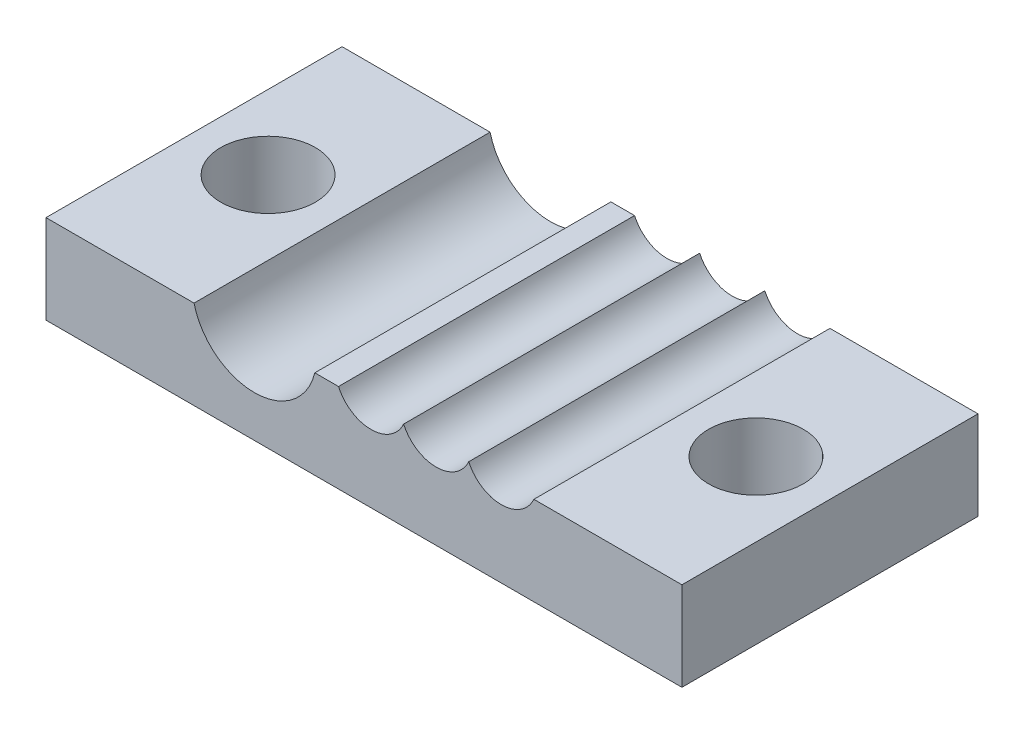
ISO-10303-21;
HEADER;
FILE_DESCRIPTION(('STEP AP214'),'2;1');
FILE_NAME('part.step','',(''),(''),'','','');
FILE_SCHEMA(('AUTOMOTIVE_DESIGN { 1 0 10303 214 1 1 1 1 }'));
ENDSEC;
DATA;
#1=APPLICATION_CONTEXT('core data for automotive mechanical design processes');
#2=APPLICATION_PROTOCOL_DEFINITION('international standard','automotive_design',2000,#1);
#3=PRODUCT_CONTEXT('',#1,'mechanical');
#4=PRODUCT('Part','Part','',(#3));
#5=PRODUCT_RELATED_PRODUCT_CATEGORY('part','',(#4));
#6=PRODUCT_DEFINITION_FORMATION('','',#4);
#7=PRODUCT_DEFINITION_CONTEXT('part definition',#1,'design');
#8=PRODUCT_DEFINITION('design','',#6,#7);
#9=PRODUCT_DEFINITION_SHAPE('','',#8);
#10=(LENGTH_UNIT() NAMED_UNIT(*) SI_UNIT(.MILLI.,.METRE.));
#11=(NAMED_UNIT(*) PLANE_ANGLE_UNIT() SI_UNIT($,.RADIAN.));
#12=(NAMED_UNIT(*) SI_UNIT($,.STERADIAN.) SOLID_ANGLE_UNIT());
#13=UNCERTAINTY_MEASURE_WITH_UNIT(LENGTH_MEASURE(1.E-05),#10,'distance_accuracy_value','');
#14=(GEOMETRIC_REPRESENTATION_CONTEXT(3) GLOBAL_UNCERTAINTY_ASSIGNED_CONTEXT((#13)) GLOBAL_UNIT_ASSIGNED_CONTEXT((#10,
#11,#12)) REPRESENTATION_CONTEXT('',''));
#15=CARTESIAN_POINT('',(0.,0.,0.));
#16=DIRECTION('',(0.,0.,1.));
#17=DIRECTION('',(1.,0.,0.));
#18=AXIS2_PLACEMENT_3D('',#15,#16,#17);
#19=CARTESIAN_POINT('',(0.,0.,10.));
#20=DIRECTION('',(1.,0.,0.));
#21=DIRECTION('',(0.,0.,-1.));
#22=AXIS2_PLACEMENT_3D('',#19,#20,#21);
#23=PLANE('',#22);
#24=DIRECTION('',(0.,-1.,0.));
#25=VECTOR('',#24,1.);
#26=CARTESIAN_POINT('',(0.,0.,0.));
#27=LINE('',#26,#25);
#28=CARTESIAN_POINT('',(0.,3.,0.));
#29=VERTEX_POINT('',#28);
#30=CARTESIAN_POINT('',(0.,0.,0.));
#31=VERTEX_POINT('',#30);
#32=EDGE_CURVE('E145',#29,#31,#27,.T.);
#33=ORIENTED_EDGE('',*,*,#32,.T.);
#34=DIRECTION('',(0.,0.,-1.));
#35=VECTOR('',#34,1.);
#36=CARTESIAN_POINT('',(0.,0.,10.));
#37=LINE('',#36,#35);
#38=CARTESIAN_POINT('',(0.,0.,10.));
#39=VERTEX_POINT('',#38);
#40=EDGE_CURVE('E11',#39,#31,#37,.T.);
#41=ORIENTED_EDGE('',*,*,#40,.F.);
#42=DIRECTION('',(0.,-1.,0.));
#43=VECTOR('',#42,1.);
#44=CARTESIAN_POINT('',(0.,0.,10.));
#45=LINE('',#44,#43);
#46=CARTESIAN_POINT('',(0.,3.,10.));
#47=VERTEX_POINT('',#46);
#48=EDGE_CURVE('E164',#47,#39,#45,.T.);
#49=ORIENTED_EDGE('',*,*,#48,.F.);
#50=DIRECTION('',(0.,0.,-1.));
#51=VECTOR('',#50,1.);
#52=CARTESIAN_POINT('',(0.,3.,10.));
#53=LINE('',#52,#51);
#54=EDGE_CURVE('E141',#47,#29,#53,.T.);
#55=ORIENTED_EDGE('',*,*,#54,.T.);
#56=EDGE_LOOP('',(#33,#41,#49,#55));
#57=FACE_BOUND('',#56,.T.);
#58=ADVANCED_FACE('F37',(#57),#23,.F.);
#59=CARTESIAN_POINT('',(0.,0.,10.));
#60=DIRECTION('',(0.,1.,0.));
#61=DIRECTION('',(-1.,0.,0.));
#62=AXIS2_PLACEMENT_3D('',#59,#60,#61);
#63=PLANE('',#62);
#64=CARTESIAN_POINT('',(2.5,0.,5.));
#65=DIRECTION('',(0.,-1.,0.));
#66=DIRECTION('',(1.,0.,0.));
#67=AXIS2_PLACEMENT_3D('',#64,#65,#66);
#68=CIRCLE('',#67,1.6);
#69=CARTESIAN_POINT('',(4.1,0.,5.));
#70=VERTEX_POINT('',#69);
#71=EDGE_CURVE('E217',#70,#70,#68,.T.);
#72=ORIENTED_EDGE('',*,*,#71,.F.);
#73=EDGE_LOOP('',(#72));
#74=FACE_BOUND('',#73,.T.);
#75=CARTESIAN_POINT('',(18.9792156108742,0.,5.));
#76=DIRECTION('',(0.,-1.,0.));
#77=DIRECTION('',(1.,0.,0.));
#78=AXIS2_PLACEMENT_3D('',#75,#76,#77);
#79=CIRCLE('',#78,1.6);
#80=CARTESIAN_POINT('',(20.5792156108742,0.,5.));
#81=VERTEX_POINT('',#80);
#82=EDGE_CURVE('E214',#81,#81,#79,.T.);
#83=ORIENTED_EDGE('',*,*,#82,.F.);
#84=EDGE_LOOP('',(#83));
#85=FACE_BOUND('',#84,.T.);
#86=DIRECTION('',(1.,0.,0.));
#87=VECTOR('',#86,1.);
#88=CARTESIAN_POINT('',(0.,0.,0.));
#89=LINE('',#88,#87);
#90=CARTESIAN_POINT('',(21.4792156108742,0.,0.));
#91=VERTEX_POINT('',#90);
#92=EDGE_CURVE('E148',#31,#91,#89,.T.);
#93=ORIENTED_EDGE('',*,*,#92,.T.);
#94=DIRECTION('',(0.,0.,-1.));
#95=VECTOR('',#94,1.);
#96=CARTESIAN_POINT('',(21.4792156108742,0.,10.));
#97=LINE('',#96,#95);
#98=CARTESIAN_POINT('',(21.4792156108742,0.,10.));
#99=VERTEX_POINT('',#98);
#100=EDGE_CURVE('E45',#99,#91,#97,.T.);
#101=ORIENTED_EDGE('',*,*,#100,.F.);
#102=DIRECTION('',(1.,0.,0.));
#103=VECTOR('',#102,1.);
#104=CARTESIAN_POINT('',(0.,0.,10.));
#105=LINE('',#104,#103);
#106=EDGE_CURVE('E102',#39,#99,#105,.T.);
#107=ORIENTED_EDGE('',*,*,#106,.F.);
#108=ORIENTED_EDGE('',*,*,#40,.T.);
#109=EDGE_LOOP('',(#93,#101,#107,#108));
#110=FACE_BOUND('',#109,.T.);
#111=ADVANCED_FACE('F232',(#74,#85,#110),#63,.F.);
#112=CARTESIAN_POINT('',(21.4792156108742,0.,10.));
#113=DIRECTION('',(-1.,0.,0.));
#114=DIRECTION('',(0.,0.,1.));
#115=AXIS2_PLACEMENT_3D('',#112,#113,#114);
#116=PLANE('',#115);
#117=DIRECTION('',(0.,1.,0.));
#118=VECTOR('',#117,1.);
#119=CARTESIAN_POINT('',(21.4792156108742,0.,0.));
#120=LINE('',#119,#118);
#121=CARTESIAN_POINT('',(21.4792156108742,3.,0.));
#122=VERTEX_POINT('',#121);
#123=EDGE_CURVE('E151',#91,#122,#120,.T.);
#124=ORIENTED_EDGE('',*,*,#123,.T.);
#125=DIRECTION('',(0.,0.,-1.));
#126=VECTOR('',#125,1.);
#127=CARTESIAN_POINT('',(21.4792156108742,3.,10.));
#128=LINE('',#127,#126);
#129=CARTESIAN_POINT('',(21.4792156108742,3.,10.));
#130=VERTEX_POINT('',#129);
#131=EDGE_CURVE('E177',#130,#122,#128,.T.);
#132=ORIENTED_EDGE('',*,*,#131,.F.);
#133=DIRECTION('',(0.,1.,0.));
#134=VECTOR('',#133,1.);
#135=CARTESIAN_POINT('',(21.4792156108742,0.,10.));
#136=LINE('',#135,#134);
#137=EDGE_CURVE('E185',#99,#130,#136,.T.);
#138=ORIENTED_EDGE('',*,*,#137,.F.);
#139=ORIENTED_EDGE('',*,*,#100,.T.);
#140=EDGE_LOOP('',(#124,#132,#138,#139));
#141=FACE_BOUND('',#140,.T.);
#142=ADVANCED_FACE('F183',(#141),#116,.F.);
#143=CARTESIAN_POINT('',(16.4792156108742,3.,10.));
#144=DIRECTION('',(0.,-1.,0.));
#145=DIRECTION('',(0.,0.,-1.));
#146=AXIS2_PLACEMENT_3D('',#143,#144,#145);
#147=PLANE('',#146);
#148=CARTESIAN_POINT('',(18.9792156108742,3.,5.));
#149=DIRECTION('',(0.,-1.,0.));
#150=DIRECTION('',(1.,0.,0.));
#151=AXIS2_PLACEMENT_3D('',#148,#149,#150);
#152=CIRCLE('',#151,1.6);
#153=CARTESIAN_POINT('',(20.5792156108742,3.,5.));
#154=VERTEX_POINT('',#153);
#155=EDGE_CURVE('E211',#154,#154,#152,.T.);
#156=ORIENTED_EDGE('',*,*,#155,.T.);
#157=EDGE_LOOP('',(#156));
#158=FACE_BOUND('',#157,.T.);
#159=DIRECTION('',(-1.,0.,0.));
#160=VECTOR('',#159,1.);
#161=CARTESIAN_POINT('',(16.4792156108742,3.,0.));
#162=LINE('',#161,#160);
#163=CARTESIAN_POINT('',(16.4792156108742,3.,0.));
#164=VERTEX_POINT('',#163);
#165=EDGE_CURVE('E153',#122,#164,#162,.T.);
#166=ORIENTED_EDGE('',*,*,#165,.T.);
#167=DIRECTION('',(0.,0.,-1.));
#168=VECTOR('',#167,1.);
#169=CARTESIAN_POINT('',(16.4792156108742,3.,10.));
#170=LINE('',#169,#168);
#171=CARTESIAN_POINT('',(16.4792156108742,3.,10.));
#172=VERTEX_POINT('',#171);
#173=EDGE_CURVE('E174',#172,#164,#170,.T.);
#174=ORIENTED_EDGE('',*,*,#173,.F.);
#175=DIRECTION('',(-1.,0.,0.));
#176=VECTOR('',#175,1.);
#177=CARTESIAN_POINT('',(16.4792156108742,3.,10.));
#178=LINE('',#177,#176);
#179=EDGE_CURVE('E203',#130,#172,#178,.T.);
#180=ORIENTED_EDGE('',*,*,#179,.F.);
#181=ORIENTED_EDGE('',*,*,#131,.T.);
#182=EDGE_LOOP('',(#166,#174,#180,#181));
#183=FACE_BOUND('',#182,.T.);
#184=ADVANCED_FACE('F194',(#158,#183),#147,.F.);
#185=CARTESIAN_POINT('',(15.3792156108742,3.5,10.));
#186=DIRECTION('',(0.,0.,-1.));
#187=DIRECTION('',(-1.,0.,0.));
#188=AXIS2_PLACEMENT_3D('',#185,#186,#187);
#189=CYLINDRICAL_SURFACE('',#188,1.20830459735946);
#190=CARTESIAN_POINT('',(15.3792156108742,3.5,0.));
#191=DIRECTION('',(0.,0.,-1.));
#192=DIRECTION('',(1.,0.,0.));
#193=AXIS2_PLACEMENT_3D('',#190,#191,#192);
#194=CIRCLE('',#193,1.20830459735946);
#195=CARTESIAN_POINT('',(14.2792156108742,3.,0.));
#196=VERTEX_POINT('',#195);
#197=EDGE_CURVE('E155',#164,#196,#194,.T.);
#198=ORIENTED_EDGE('',*,*,#197,.T.);
#199=DIRECTION('',(0.,0.,-1.));
#200=VECTOR('',#199,1.);
#201=CARTESIAN_POINT('',(14.2792156108742,3.,10.));
#202=LINE('',#201,#200);
#203=CARTESIAN_POINT('',(14.2792156108742,3.,10.));
#204=VERTEX_POINT('',#203);
#205=EDGE_CURVE('E171',#204,#196,#202,.T.);
#206=ORIENTED_EDGE('',*,*,#205,.F.);
#207=CARTESIAN_POINT('',(15.3792156108742,3.5,10.));
#208=DIRECTION('',(0.,0.,-1.));
#209=DIRECTION('',(1.,0.,0.));
#210=AXIS2_PLACEMENT_3D('',#207,#208,#209);
#211=CIRCLE('',#210,1.20830459735946);
#212=EDGE_CURVE('E200',#172,#204,#211,.T.);
#213=ORIENTED_EDGE('',*,*,#212,.F.);
#214=ORIENTED_EDGE('',*,*,#173,.T.);
#215=EDGE_LOOP('',(#198,#206,#213,#214));
#216=FACE_BOUND('',#215,.T.);
#217=ADVANCED_FACE('F198',(#216),#189,.F.);
#218=CARTESIAN_POINT('',(13.1792156108742,3.5,10.));
#219=DIRECTION('',(0.,0.,-1.));
#220=DIRECTION('',(-1.,0.,0.));
#221=AXIS2_PLACEMENT_3D('',#218,#219,#220);
#222=CYLINDRICAL_SURFACE('',#221,1.20830459735946);
#223=CARTESIAN_POINT('',(13.1792156108742,3.5,0.));
#224=DIRECTION('',(0.,0.,-1.));
#225=DIRECTION('',(1.,0.,0.));
#226=AXIS2_PLACEMENT_3D('',#223,#224,#225);
#227=CIRCLE('',#226,1.20830459735946);
#228=CARTESIAN_POINT('',(12.0792156108742,3.,0.));
#229=VERTEX_POINT('',#228);
#230=EDGE_CURVE('E157',#196,#229,#227,.T.);
#231=ORIENTED_EDGE('',*,*,#230,.T.);
#232=DIRECTION('',(0.,0.,-1.));
#233=VECTOR('',#232,1.);
#234=CARTESIAN_POINT('',(12.0792156108742,3.,10.));
#235=LINE('',#234,#233);
#236=CARTESIAN_POINT('',(12.0792156108742,3.,10.));
#237=VERTEX_POINT('',#236);
#238=EDGE_CURVE('E168',#237,#229,#235,.T.);
#239=ORIENTED_EDGE('',*,*,#238,.F.);
#240=CARTESIAN_POINT('',(13.1792156108742,3.5,10.));
#241=DIRECTION('',(0.,0.,-1.));
#242=DIRECTION('',(1.,0.,0.));
#243=AXIS2_PLACEMENT_3D('',#240,#241,#242);
#244=CIRCLE('',#243,1.20830459735946);
#245=EDGE_CURVE('E202',#204,#237,#244,.T.);
#246=ORIENTED_EDGE('',*,*,#245,.F.);
#247=ORIENTED_EDGE('',*,*,#205,.T.);
#248=EDGE_LOOP('',(#231,#239,#246,#247));
#249=FACE_BOUND('',#248,.T.);
#250=ADVANCED_FACE('F244',(#249),#222,.F.);
#251=CARTESIAN_POINT('',(10.9792156108742,3.5,10.));
#252=DIRECTION('',(0.,0.,-1.));
#253=DIRECTION('',(-1.,0.,0.));
#254=AXIS2_PLACEMENT_3D('',#251,#252,#253);
#255=CYLINDRICAL_SURFACE('',#254,1.20830459735946);
#256=CARTESIAN_POINT('',(10.9792156108742,3.5,0.));
#257=DIRECTION('',(0.,0.,-1.));
#258=DIRECTION('',(1.,0.,0.));
#259=AXIS2_PLACEMENT_3D('',#256,#257,#258);
#260=CIRCLE('',#259,1.20830459735946);
#261=CARTESIAN_POINT('',(9.87921561087423,3.,0.));
#262=VERTEX_POINT('',#261);
#263=EDGE_CURVE('E159',#229,#262,#260,.T.);
#264=ORIENTED_EDGE('',*,*,#263,.T.);
#265=DIRECTION('',(0.,0.,-1.));
#266=VECTOR('',#265,1.);
#267=CARTESIAN_POINT('',(9.87921561087423,3.,10.));
#268=LINE('',#267,#266);
#269=CARTESIAN_POINT('',(9.87921561087423,3.,10.));
#270=VERTEX_POINT('',#269);
#271=EDGE_CURVE('E136',#270,#262,#268,.T.);
#272=ORIENTED_EDGE('',*,*,#271,.F.);
#273=CARTESIAN_POINT('',(10.9792156108742,3.5,10.));
#274=DIRECTION('',(0.,0.,-1.));
#275=DIRECTION('',(1.,0.,0.));
#276=AXIS2_PLACEMENT_3D('',#273,#274,#275);
#277=CIRCLE('',#276,1.20830459735946);
#278=EDGE_CURVE('E127',#237,#270,#277,.T.);
#279=ORIENTED_EDGE('',*,*,#278,.F.);
#280=ORIENTED_EDGE('',*,*,#238,.T.);
#281=EDGE_LOOP('',(#264,#272,#279,#280));
#282=FACE_BOUND('',#281,.T.);
#283=ADVANCED_FACE('F241',(#282),#255,.F.);
#284=CARTESIAN_POINT('',(9.07921561087423,3.,10.));
#285=DIRECTION('',(0.,-1.,0.));
#286=DIRECTION('',(0.,0.,-1.));
#287=AXIS2_PLACEMENT_3D('',#284,#285,#286);
#288=PLANE('',#287);
#289=DIRECTION('',(-1.,0.,0.));
#290=VECTOR('',#289,1.);
#291=CARTESIAN_POINT('',(9.07921561087423,3.,0.));
#292=LINE('',#291,#290);
#293=CARTESIAN_POINT('',(9.07921561087423,3.,0.));
#294=VERTEX_POINT('',#293);
#295=EDGE_CURVE('E135',#262,#294,#292,.T.);
#296=ORIENTED_EDGE('',*,*,#295,.T.);
#297=DIRECTION('',(0.,0.,-1.));
#298=VECTOR('',#297,1.);
#299=CARTESIAN_POINT('',(9.07921561087423,3.,10.));
#300=LINE('',#299,#298);
#301=CARTESIAN_POINT('',(9.07921561087423,3.,10.));
#302=VERTEX_POINT('',#301);
#303=EDGE_CURVE('E132',#302,#294,#300,.T.);
#304=ORIENTED_EDGE('',*,*,#303,.F.);
#305=DIRECTION('',(-1.,0.,0.));
#306=VECTOR('',#305,1.);
#307=CARTESIAN_POINT('',(9.07921561087423,3.,10.));
#308=LINE('',#307,#306);
#309=EDGE_CURVE('E121',#270,#302,#308,.T.);
#310=ORIENTED_EDGE('',*,*,#309,.F.);
#311=ORIENTED_EDGE('',*,*,#271,.T.);
#312=EDGE_LOOP('',(#296,#304,#310,#311));
#313=FACE_BOUND('',#312,.T.);
#314=ADVANCED_FACE('F133',(#313),#288,.F.);
#315=CARTESIAN_POINT('',(7.03960780543711,3.5,10.));
#316=DIRECTION('',(0.,0.,-1.));
#317=DIRECTION('',(-1.,0.,0.));
#318=AXIS2_PLACEMENT_3D('',#315,#316,#317);
#319=CYLINDRICAL_SURFACE('',#318,2.1);
#320=CARTESIAN_POINT('',(7.03960780543711,3.5,0.));
#321=DIRECTION('',(0.,0.,-1.));
#322=DIRECTION('',(1.,0.,0.));
#323=AXIS2_PLACEMENT_3D('',#320,#321,#322);
#324=CIRCLE('',#323,2.1);
#325=CARTESIAN_POINT('',(5.,3.,0.));
#326=VERTEX_POINT('',#325);
#327=EDGE_CURVE('E88',#294,#326,#324,.T.);
#328=ORIENTED_EDGE('',*,*,#327,.T.);
#329=DIRECTION('',(0.,0.,-1.));
#330=VECTOR('',#329,1.);
#331=CARTESIAN_POINT('',(5.,3.,10.));
#332=LINE('',#331,#330);
#333=CARTESIAN_POINT('',(5.,3.,10.));
#334=VERTEX_POINT('',#333);
#335=EDGE_CURVE('E137',#334,#326,#332,.T.);
#336=ORIENTED_EDGE('',*,*,#335,.F.);
#337=CARTESIAN_POINT('',(7.03960780543711,3.5,10.));
#338=DIRECTION('',(0.,0.,-1.));
#339=DIRECTION('',(1.,0.,0.));
#340=AXIS2_PLACEMENT_3D('',#337,#338,#339);
#341=CIRCLE('',#340,2.1);
#342=EDGE_CURVE('E125',#302,#334,#341,.T.);
#343=ORIENTED_EDGE('',*,*,#342,.F.);
#344=ORIENTED_EDGE('',*,*,#303,.T.);
#345=EDGE_LOOP('',(#328,#336,#343,#344));
#346=FACE_BOUND('',#345,.T.);
#347=ADVANCED_FACE('F139',(#346),#319,.F.);
#348=CARTESIAN_POINT('',(0.,3.,10.));
#349=DIRECTION('',(0.,-1.,0.));
#350=DIRECTION('',(0.,0.,-1.));
#351=AXIS2_PLACEMENT_3D('',#348,#349,#350);
#352=PLANE('',#351);
#353=CARTESIAN_POINT('',(2.5,3.,5.));
#354=DIRECTION('',(0.,-1.,0.));
#355=DIRECTION('',(1.,0.,0.));
#356=AXIS2_PLACEMENT_3D('',#353,#354,#355);
#357=CIRCLE('',#356,1.6);
#358=CARTESIAN_POINT('',(4.1,3.,5.));
#359=VERTEX_POINT('',#358);
#360=EDGE_CURVE('E149',#359,#359,#357,.T.);
#361=ORIENTED_EDGE('',*,*,#360,.T.);
#362=EDGE_LOOP('',(#361));
#363=FACE_BOUND('',#362,.T.);
#364=DIRECTION('',(-1.,0.,0.));
#365=VECTOR('',#364,1.);
#366=CARTESIAN_POINT('',(0.,3.,0.));
#367=LINE('',#366,#365);
#368=EDGE_CURVE('E94',#326,#29,#367,.T.);
#369=ORIENTED_EDGE('',*,*,#368,.T.);
#370=ORIENTED_EDGE('',*,*,#54,.F.);
#371=DIRECTION('',(-1.,0.,0.));
#372=VECTOR('',#371,1.);
#373=CARTESIAN_POINT('',(0.,3.,10.));
#374=LINE('',#373,#372);
#375=EDGE_CURVE('E53',#334,#47,#374,.T.);
#376=ORIENTED_EDGE('',*,*,#375,.F.);
#377=ORIENTED_EDGE('',*,*,#335,.T.);
#378=EDGE_LOOP('',(#369,#370,#376,#377));
#379=FACE_BOUND('',#378,.T.);
#380=ADVANCED_FACE('F223',(#363,#379),#352,.F.);
#381=CARTESIAN_POINT('',(7.03960780543711,3.5,10.));
#382=DIRECTION('',(0.,0.,1.));
#383=DIRECTION('',(1.,0.,0.));
#384=AXIS2_PLACEMENT_3D('',#381,#382,#383);
#385=PLANE('',#384);
#386=ORIENTED_EDGE('',*,*,#48,.T.);
#387=ORIENTED_EDGE('',*,*,#106,.T.);
#388=ORIENTED_EDGE('',*,*,#137,.T.);
#389=ORIENTED_EDGE('',*,*,#179,.T.);
#390=ORIENTED_EDGE('',*,*,#212,.T.);
#391=ORIENTED_EDGE('',*,*,#245,.T.);
#392=ORIENTED_EDGE('',*,*,#278,.T.);
#393=ORIENTED_EDGE('',*,*,#309,.T.);
#394=ORIENTED_EDGE('',*,*,#342,.T.);
#395=ORIENTED_EDGE('',*,*,#375,.T.);
#396=EDGE_LOOP('',(#386,#387,#388,#389,#390,#391,#392,#393,#394,#395));
#397=FACE_BOUND('',#396,.T.);
#398=ADVANCED_FACE('F123',(#397),#385,.T.);
#399=CARTESIAN_POINT('',(7.03960780543711,3.5,0.));
#400=DIRECTION('',(0.,0.,1.));
#401=DIRECTION('',(1.,0.,0.));
#402=AXIS2_PLACEMENT_3D('',#399,#400,#401);
#403=PLANE('',#402);
#404=ORIENTED_EDGE('',*,*,#32,.F.);
#405=ORIENTED_EDGE('',*,*,#368,.F.);
#406=ORIENTED_EDGE('',*,*,#327,.F.);
#407=ORIENTED_EDGE('',*,*,#295,.F.);
#408=ORIENTED_EDGE('',*,*,#263,.F.);
#409=ORIENTED_EDGE('',*,*,#230,.F.);
#410=ORIENTED_EDGE('',*,*,#197,.F.);
#411=ORIENTED_EDGE('',*,*,#165,.F.);
#412=ORIENTED_EDGE('',*,*,#123,.F.);
#413=ORIENTED_EDGE('',*,*,#92,.F.);
#414=EDGE_LOOP('',(#404,#405,#406,#407,#408,#409,#410,#411,#412,#413));
#415=FACE_BOUND('',#414,.T.);
#416=ADVANCED_FACE('F189',(#415),#403,.F.);
#417=CARTESIAN_POINT('',(2.5,3.,5.));
#418=DIRECTION('',(0.,-1.,0.));
#419=DIRECTION('',(1.,0.,0.));
#420=AXIS2_PLACEMENT_3D('',#417,#418,#419);
#421=CYLINDRICAL_SURFACE('',#420,1.6);
#422=ORIENTED_EDGE('',*,*,#360,.F.);
#423=EDGE_LOOP('',(#422));
#424=FACE_BOUND('',#423,.T.);
#425=ORIENTED_EDGE('',*,*,#71,.T.);
#426=EDGE_LOOP('',(#425));
#427=FACE_BOUND('',#426,.T.);
#428=ADVANCED_FACE('F225',(#424,#427),#421,.F.);
#429=CARTESIAN_POINT('',(18.9792156108742,3.,5.));
#430=DIRECTION('',(0.,-1.,0.));
#431=DIRECTION('',(1.,0.,0.));
#432=AXIS2_PLACEMENT_3D('',#429,#430,#431);
#433=CYLINDRICAL_SURFACE('',#432,1.6);
#434=ORIENTED_EDGE('',*,*,#155,.F.);
#435=EDGE_LOOP('',(#434));
#436=FACE_BOUND('',#435,.T.);
#437=ORIENTED_EDGE('',*,*,#82,.T.);
#438=EDGE_LOOP('',(#437));
#439=FACE_BOUND('',#438,.T.);
#440=ADVANCED_FACE('F228',(#436,#439),#433,.F.);
#441=CLOSED_SHELL('',(#58,#111,#142,#184,#217,#250,#283,#314,#347,#380,#398,#416,#428,#440));
#442=MANIFOLD_SOLID_BREP('B2',#441);
#443=ADVANCED_BREP_SHAPE_REPRESENTATION('',(#18,#442),#14);
#444=SHAPE_DEFINITION_REPRESENTATION(#9,#443);
ENDSEC;
END-ISO-10303-21;
